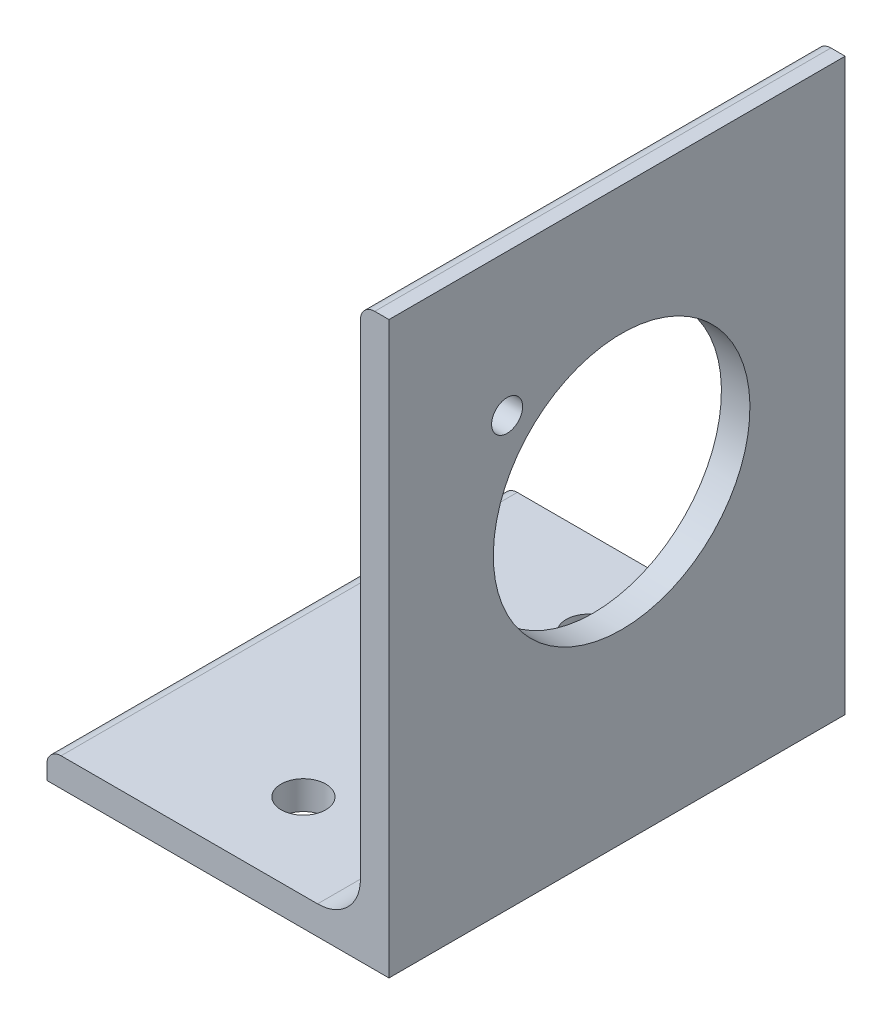
ISO-10303-21;
HEADER;
FILE_DESCRIPTION(('STEP AP214'),'2;1');
FILE_NAME('part.step','',(''),(''),'','','');
FILE_SCHEMA(('AUTOMOTIVE_DESIGN { 1 0 10303 214 1 1 1 1 }'));
ENDSEC;
DATA;
#1=APPLICATION_CONTEXT('core data for automotive mechanical design processes');
#2=APPLICATION_PROTOCOL_DEFINITION('international standard','automotive_design',2000,#1);
#3=PRODUCT_CONTEXT('',#1,'mechanical');
#4=PRODUCT('Part','Part','',(#3));
#5=PRODUCT_RELATED_PRODUCT_CATEGORY('part','',(#4));
#6=PRODUCT_DEFINITION_FORMATION('','',#4);
#7=PRODUCT_DEFINITION_CONTEXT('part definition',#1,'design');
#8=PRODUCT_DEFINITION('design','',#6,#7);
#9=PRODUCT_DEFINITION_SHAPE('','',#8);
#10=(LENGTH_UNIT() NAMED_UNIT(*) SI_UNIT(.MILLI.,.METRE.));
#11=(NAMED_UNIT(*) PLANE_ANGLE_UNIT() SI_UNIT($,.RADIAN.));
#12=(NAMED_UNIT(*) SI_UNIT($,.STERADIAN.) SOLID_ANGLE_UNIT());
#13=UNCERTAINTY_MEASURE_WITH_UNIT(LENGTH_MEASURE(1.E-05),#10,'distance_accuracy_value','');
#14=(GEOMETRIC_REPRESENTATION_CONTEXT(3) GLOBAL_UNCERTAINTY_ASSIGNED_CONTEXT((#13)) GLOBAL_UNIT_ASSIGNED_CONTEXT((#10,
#11,#12)) REPRESENTATION_CONTEXT('',''));
#15=CARTESIAN_POINT('',(0.,0.,0.));
#16=DIRECTION('',(0.,0.,1.));
#17=DIRECTION('',(1.,0.,0.));
#18=AXIS2_PLACEMENT_3D('',#15,#16,#17);
#19=CARTESIAN_POINT('',(-19.05,-30.1625,25.4));
#20=DIRECTION('',(1.,0.,0.));
#21=DIRECTION('',(0.,0.,-1.));
#22=AXIS2_PLACEMENT_3D('',#19,#20,#21);
#23=PLANE('',#22);
#24=DIRECTION('',(0.,-1.,0.));
#25=VECTOR('',#24,1.);
#26=CARTESIAN_POINT('',(-19.05,-30.1625,-25.4));
#27=LINE('',#26,#25);
#28=CARTESIAN_POINT('',(-19.05,-30.1625,-25.4));
#29=VERTEX_POINT('',#28);
#30=CARTESIAN_POINT('',(-19.05,-31.75,-25.4));
#31=VERTEX_POINT('',#30);
#32=EDGE_CURVE('E143',#29,#31,#27,.T.);
#33=ORIENTED_EDGE('',*,*,#32,.T.);
#34=DIRECTION('',(0.,0.,-1.));
#35=VECTOR('',#34,1.);
#36=CARTESIAN_POINT('',(-19.05,-31.75,25.4));
#37=LINE('',#36,#35);
#38=CARTESIAN_POINT('',(-19.05,-31.75,25.4));
#39=VERTEX_POINT('',#38);
#40=EDGE_CURVE('E11',#39,#31,#37,.T.);
#41=ORIENTED_EDGE('',*,*,#40,.F.);
#42=DIRECTION('',(0.,-1.,0.));
#43=VECTOR('',#42,1.);
#44=CARTESIAN_POINT('',(-19.05,-30.1625,25.4));
#45=LINE('',#44,#43);
#46=CARTESIAN_POINT('',(-19.05,-30.1625,25.4));
#47=VERTEX_POINT('',#46);
#48=EDGE_CURVE('E160',#47,#39,#45,.T.);
#49=ORIENTED_EDGE('',*,*,#48,.F.);
#50=DIRECTION('',(0.,0.,-1.));
#51=VECTOR('',#50,1.);
#52=CARTESIAN_POINT('',(-19.05,-30.1625,25.4));
#53=LINE('',#52,#51);
#54=EDGE_CURVE('E139',#47,#29,#53,.T.);
#55=ORIENTED_EDGE('',*,*,#54,.T.);
#56=EDGE_LOOP('',(#33,#41,#49,#55));
#57=FACE_BOUND('',#56,.T.);
#58=ADVANCED_FACE('F39',(#57),#23,.F.);
#59=CARTESIAN_POINT('',(-19.05,-31.75,25.4));
#60=DIRECTION('',(0.,1.,0.));
#61=DIRECTION('',(-1.,0.,0.));
#62=AXIS2_PLACEMENT_3D('',#59,#60,#61);
#63=PLANE('',#62);
#64=CARTESIAN_POINT('',(0.,-31.75,15.875));
#65=DIRECTION('',(0.,-1.,0.));
#66=DIRECTION('',(1.,0.,0.));
#67=AXIS2_PLACEMENT_3D('',#64,#65,#66);
#68=CIRCLE('',#67,2.4892);
#69=CARTESIAN_POINT('',(2.4892,-31.75,15.875));
#70=VERTEX_POINT('',#69);
#71=EDGE_CURVE('E176',#70,#70,#68,.T.);
#72=ORIENTED_EDGE('',*,*,#71,.F.);
#73=EDGE_LOOP('',(#72));
#74=FACE_BOUND('',#73,.T.);
#75=CARTESIAN_POINT('',(0.,-31.75,-15.875));
#76=DIRECTION('',(0.,-1.,0.));
#77=DIRECTION('',(1.,0.,0.));
#78=AXIS2_PLACEMENT_3D('',#75,#76,#77);
#79=CIRCLE('',#78,2.4892);
#80=CARTESIAN_POINT('',(2.4892,-31.75,-15.875));
#81=VERTEX_POINT('',#80);
#82=EDGE_CURVE('E182',#81,#81,#79,.T.);
#83=ORIENTED_EDGE('',*,*,#82,.F.);
#84=EDGE_LOOP('',(#83));
#85=FACE_BOUND('',#84,.T.);
#86=DIRECTION('',(1.,0.,0.));
#87=VECTOR('',#86,1.);
#88=CARTESIAN_POINT('',(-19.05,-31.75,-25.4));
#89=LINE('',#88,#87);
#90=CARTESIAN_POINT('',(19.05,-31.75,-25.4));
#91=VERTEX_POINT('',#90);
#92=EDGE_CURVE('E146',#31,#91,#89,.T.);
#93=ORIENTED_EDGE('',*,*,#92,.T.);
#94=DIRECTION('',(0.,0.,-1.));
#95=VECTOR('',#94,1.);
#96=CARTESIAN_POINT('',(19.05,-31.75,25.4));
#97=LINE('',#96,#95);
#98=CARTESIAN_POINT('',(19.05,-31.75,25.4));
#99=VERTEX_POINT('',#98);
#100=EDGE_CURVE('E48',#99,#91,#97,.T.);
#101=ORIENTED_EDGE('',*,*,#100,.F.);
#102=DIRECTION('',(1.,0.,0.));
#103=VECTOR('',#102,1.);
#104=CARTESIAN_POINT('',(-19.05,-31.75,25.4));
#105=LINE('',#104,#103);
#106=EDGE_CURVE('E103',#39,#99,#105,.T.);
#107=ORIENTED_EDGE('',*,*,#106,.F.);
#108=ORIENTED_EDGE('',*,*,#40,.T.);
#109=EDGE_LOOP('',(#93,#101,#107,#108));
#110=FACE_BOUND('',#109,.T.);
#111=ADVANCED_FACE('F235',(#74,#85,#110),#63,.F.);
#112=CARTESIAN_POINT('',(19.05,-31.75,25.4));
#113=DIRECTION('',(-1.,0.,0.));
#114=DIRECTION('',(0.,-1.,0.));
#115=AXIS2_PLACEMENT_3D('',#112,#113,#114);
#116=PLANE('',#115);
#117=CARTESIAN_POINT('',(19.05,15.9269636919197,12.2439637819415));
#118=DIRECTION('',(-1.,0.,0.));
#119=DIRECTION('',(0.,-1.,0.));
#120=AXIS2_PLACEMENT_3D('',#117,#118,#119);
#121=CIRCLE('',#120,1.72719999999923);
#122=CARTESIAN_POINT('',(19.05,14.1997636919204,12.2439637819415));
#123=VERTEX_POINT('',#122);
#124=EDGE_CURVE('E180',#123,#123,#121,.T.);
#125=ORIENTED_EDGE('',*,*,#124,.T.);
#126=EDGE_LOOP('',(#125));
#127=FACE_BOUND('',#126,.T.);
#128=CARTESIAN_POINT('',(19.05,3.17500000000147,-0.507999909976729));
#129=DIRECTION('',(-1.,0.,0.));
#130=DIRECTION('',(0.,-1.,0.));
#131=AXIS2_PLACEMENT_3D('',#128,#129,#130);
#132=CIRCLE('',#131,14.2874999999992);
#133=CARTESIAN_POINT('',(19.05,-11.1124999999978,-0.507999909976729));
#134=VERTEX_POINT('',#133);
#135=EDGE_CURVE('E147',#134,#134,#132,.T.);
#136=ORIENTED_EDGE('',*,*,#135,.T.);
#137=EDGE_LOOP('',(#136));
#138=FACE_BOUND('',#137,.T.);
#139=DIRECTION('',(0.,1.,0.));
#140=VECTOR('',#139,1.);
#141=CARTESIAN_POINT('',(19.05,-31.75,-25.4));
#142=LINE('',#141,#140);
#143=CARTESIAN_POINT('',(19.05,31.75,-25.4));
#144=VERTEX_POINT('',#143);
#145=EDGE_CURVE('E149',#91,#144,#142,.T.);
#146=ORIENTED_EDGE('',*,*,#145,.T.);
#147=DIRECTION('',(0.,0.,-1.));
#148=VECTOR('',#147,1.);
#149=CARTESIAN_POINT('',(19.05,31.75,25.4));
#150=LINE('',#149,#148);
#151=CARTESIAN_POINT('',(19.05,31.75,25.4));
#152=VERTEX_POINT('',#151);
#153=EDGE_CURVE('E170',#152,#144,#150,.T.);
#154=ORIENTED_EDGE('',*,*,#153,.F.);
#155=DIRECTION('',(0.,1.,0.));
#156=VECTOR('',#155,1.);
#157=CARTESIAN_POINT('',(19.05,-31.75,25.4));
#158=LINE('',#157,#156);
#159=EDGE_CURVE('E201',#99,#152,#158,.T.);
#160=ORIENTED_EDGE('',*,*,#159,.F.);
#161=ORIENTED_EDGE('',*,*,#100,.T.);
#162=EDGE_LOOP('',(#146,#154,#160,#161));
#163=FACE_BOUND('',#162,.T.);
#164=ADVANCED_FACE('F239',(#127,#138,#163),#116,.F.);
#165=CARTESIAN_POINT('',(17.4625,31.75,25.4));
#166=DIRECTION('',(0.,-1.,0.));
#167=DIRECTION('',(1.,0.,0.));
#168=AXIS2_PLACEMENT_3D('',#165,#166,#167);
#169=PLANE('',#168);
#170=DIRECTION('',(-1.,0.,0.));
#171=VECTOR('',#170,1.);
#172=CARTESIAN_POINT('',(17.4625,31.75,-25.4));
#173=LINE('',#172,#171);
#174=CARTESIAN_POINT('',(17.4625,31.75,-25.4));
#175=VERTEX_POINT('',#174);
#176=EDGE_CURVE('E151',#144,#175,#173,.T.);
#177=ORIENTED_EDGE('',*,*,#176,.T.);
#178=DIRECTION('',(0.,0.,-1.));
#179=VECTOR('',#178,1.);
#180=CARTESIAN_POINT('',(17.4625,31.75,25.4));
#181=LINE('',#180,#179);
#182=CARTESIAN_POINT('',(17.4625,31.75,25.4));
#183=VERTEX_POINT('',#182);
#184=EDGE_CURVE('E167',#183,#175,#181,.T.);
#185=ORIENTED_EDGE('',*,*,#184,.F.);
#186=DIRECTION('',(-1.,0.,0.));
#187=VECTOR('',#186,1.);
#188=CARTESIAN_POINT('',(17.4625,31.75,25.4));
#189=LINE('',#188,#187);
#190=EDGE_CURVE('E203',#152,#183,#189,.T.);
#191=ORIENTED_EDGE('',*,*,#190,.F.);
#192=ORIENTED_EDGE('',*,*,#153,.T.);
#193=EDGE_LOOP('',(#177,#185,#191,#192));
#194=FACE_BOUND('',#193,.T.);
#195=ADVANCED_FACE('F244',(#194),#169,.F.);
#196=CARTESIAN_POINT('',(17.4625,30.1625,25.4));
#197=DIRECTION('',(0.,0.,-1.));
#198=DIRECTION('',(-1.,0.,0.));
#199=AXIS2_PLACEMENT_3D('',#196,#197,#198);
#200=CYLINDRICAL_SURFACE('',#199,1.5875);
#201=CARTESIAN_POINT('',(17.4625,30.1625,-25.4));
#202=DIRECTION('',(0.,0.,1.));
#203=DIRECTION('',(-1.,0.,0.));
#204=AXIS2_PLACEMENT_3D('',#201,#202,#203);
#205=CIRCLE('',#204,1.5875);
#206=CARTESIAN_POINT('',(15.875,30.1625,-25.4));
#207=VERTEX_POINT('',#206);
#208=EDGE_CURVE('E153',#175,#207,#205,.T.);
#209=ORIENTED_EDGE('',*,*,#208,.T.);
#210=DIRECTION('',(0.,0.,-1.));
#211=VECTOR('',#210,1.);
#212=CARTESIAN_POINT('',(15.875,30.1625,25.4));
#213=LINE('',#212,#211);
#214=CARTESIAN_POINT('',(15.875,30.1625,25.4));
#215=VERTEX_POINT('',#214);
#216=EDGE_CURVE('E164',#215,#207,#213,.T.);
#217=ORIENTED_EDGE('',*,*,#216,.F.);
#218=CARTESIAN_POINT('',(17.4625,30.1625,25.4));
#219=DIRECTION('',(0.,0.,1.));
#220=DIRECTION('',(-1.,0.,0.));
#221=AXIS2_PLACEMENT_3D('',#218,#219,#220);
#222=CIRCLE('',#221,1.5875);
#223=EDGE_CURVE('E205',#183,#215,#222,.T.);
#224=ORIENTED_EDGE('',*,*,#223,.F.);
#225=ORIENTED_EDGE('',*,*,#184,.T.);
#226=EDGE_LOOP('',(#209,#217,#224,#225));
#227=FACE_BOUND('',#226,.T.);
#228=ADVANCED_FACE('F211',(#227),#200,.T.);
#229=CARTESIAN_POINT('',(15.875,30.1625,25.4));
#230=DIRECTION('',(1.,0.,0.));
#231=DIRECTION('',(0.,1.,0.));
#232=AXIS2_PLACEMENT_3D('',#229,#230,#231);
#233=PLANE('',#232);
#234=CARTESIAN_POINT('',(15.875,15.9269636919197,12.2439637819415));
#235=DIRECTION('',(-1.,0.,0.));
#236=DIRECTION('',(0.,-1.,0.));
#237=AXIS2_PLACEMENT_3D('',#234,#235,#236);
#238=CIRCLE('',#237,1.72719999999923);
#239=CARTESIAN_POINT('',(15.875,14.1997636919204,12.2439637819415));
#240=VERTEX_POINT('',#239);
#241=EDGE_CURVE('E189',#240,#240,#238,.T.);
#242=ORIENTED_EDGE('',*,*,#241,.F.);
#243=EDGE_LOOP('',(#242));
#244=FACE_BOUND('',#243,.T.);
#245=CARTESIAN_POINT('',(15.875,3.17500000000147,-0.507999909976729));
#246=DIRECTION('',(-1.,0.,0.));
#247=DIRECTION('',(0.,-1.,0.));
#248=AXIS2_PLACEMENT_3D('',#245,#246,#247);
#249=CIRCLE('',#248,14.2874999999992);
#250=CARTESIAN_POINT('',(15.875,-11.1124999999978,-0.507999909976729));
#251=VERTEX_POINT('',#250);
#252=EDGE_CURVE('E192',#251,#251,#249,.T.);
#253=ORIENTED_EDGE('',*,*,#252,.F.);
#254=EDGE_LOOP('',(#253));
#255=FACE_BOUND('',#254,.T.);
#256=DIRECTION('',(0.,-1.,0.));
#257=VECTOR('',#256,1.);
#258=CARTESIAN_POINT('',(15.875,30.1625,-25.4));
#259=LINE('',#258,#257);
#260=CARTESIAN_POINT('',(15.875,-23.7998,-25.4));
#261=VERTEX_POINT('',#260);
#262=EDGE_CURVE('E155',#207,#261,#259,.T.);
#263=ORIENTED_EDGE('',*,*,#262,.T.);
#264=DIRECTION('',(0.,0.,-1.));
#265=VECTOR('',#264,1.);
#266=CARTESIAN_POINT('',(15.875,-23.7998,25.4));
#267=LINE('',#266,#265);
#268=CARTESIAN_POINT('',(15.875,-23.7998,25.4));
#269=VERTEX_POINT('',#268);
#270=EDGE_CURVE('E134',#269,#261,#267,.T.);
#271=ORIENTED_EDGE('',*,*,#270,.F.);
#272=DIRECTION('',(0.,-1.,0.));
#273=VECTOR('',#272,1.);
#274=CARTESIAN_POINT('',(15.875,30.1625,25.4));
#275=LINE('',#274,#273);
#276=EDGE_CURVE('E125',#215,#269,#275,.T.);
#277=ORIENTED_EDGE('',*,*,#276,.F.);
#278=ORIENTED_EDGE('',*,*,#216,.T.);
#279=EDGE_LOOP('',(#263,#271,#277,#278));
#280=FACE_BOUND('',#279,.T.);
#281=ADVANCED_FACE('F215',(#244,#255,#280),#233,.F.);
#282=CARTESIAN_POINT('',(11.0998,-23.7998,25.4));
#283=DIRECTION('',(0.,0.,-1.));
#284=DIRECTION('',(-1.,0.,0.));
#285=AXIS2_PLACEMENT_3D('',#282,#283,#284);
#286=CYLINDRICAL_SURFACE('',#285,4.7752);
#287=CARTESIAN_POINT('',(11.0998,-23.7998,-25.4));
#288=DIRECTION('',(0.,0.,-1.));
#289=DIRECTION('',(-1.,0.,0.));
#290=AXIS2_PLACEMENT_3D('',#287,#288,#289);
#291=CIRCLE('',#290,4.7752);
#292=CARTESIAN_POINT('',(11.0998,-28.575,-25.4));
#293=VERTEX_POINT('',#292);
#294=EDGE_CURVE('E133',#261,#293,#291,.T.);
#295=ORIENTED_EDGE('',*,*,#294,.T.);
#296=DIRECTION('',(0.,0.,-1.));
#297=VECTOR('',#296,1.);
#298=CARTESIAN_POINT('',(11.0998,-28.575,25.4));
#299=LINE('',#298,#297);
#300=CARTESIAN_POINT('',(11.0998,-28.575,25.4));
#301=VERTEX_POINT('',#300);
#302=EDGE_CURVE('E130',#301,#293,#299,.T.);
#303=ORIENTED_EDGE('',*,*,#302,.F.);
#304=CARTESIAN_POINT('',(11.0998,-23.7998,25.4));
#305=DIRECTION('',(0.,0.,-1.));
#306=DIRECTION('',(-1.,0.,0.));
#307=AXIS2_PLACEMENT_3D('',#304,#305,#306);
#308=CIRCLE('',#307,4.7752);
#309=EDGE_CURVE('E119',#269,#301,#308,.T.);
#310=ORIENTED_EDGE('',*,*,#309,.F.);
#311=ORIENTED_EDGE('',*,*,#270,.T.);
#312=EDGE_LOOP('',(#295,#303,#310,#311));
#313=FACE_BOUND('',#312,.T.);
#314=ADVANCED_FACE('F131',(#313),#286,.F.);
#315=CARTESIAN_POINT('',(11.0998,-28.575,25.4));
#316=DIRECTION('',(0.,-1.,0.));
#317=DIRECTION('',(1.,0.,0.));
#318=AXIS2_PLACEMENT_3D('',#315,#316,#317);
#319=PLANE('',#318);
#320=CARTESIAN_POINT('',(0.,-28.575,15.875));
#321=DIRECTION('',(0.,-1.,0.));
#322=DIRECTION('',(1.,0.,0.));
#323=AXIS2_PLACEMENT_3D('',#320,#321,#322);
#324=CIRCLE('',#323,2.4892);
#325=CARTESIAN_POINT('',(2.4892,-28.575,15.875));
#326=VERTEX_POINT('',#325);
#327=EDGE_CURVE('E42',#326,#326,#324,.T.);
#328=ORIENTED_EDGE('',*,*,#327,.T.);
#329=EDGE_LOOP('',(#328));
#330=FACE_BOUND('',#329,.T.);
#331=CARTESIAN_POINT('',(0.,-28.575,-15.875));
#332=DIRECTION('',(0.,-1.,0.));
#333=DIRECTION('',(1.,0.,0.));
#334=AXIS2_PLACEMENT_3D('',#331,#332,#333);
#335=CIRCLE('',#334,2.4892);
#336=CARTESIAN_POINT('',(2.4892,-28.575,-15.875));
#337=VERTEX_POINT('',#336);
#338=EDGE_CURVE('E174',#337,#337,#335,.T.);
#339=ORIENTED_EDGE('',*,*,#338,.T.);
#340=EDGE_LOOP('',(#339));
#341=FACE_BOUND('',#340,.T.);
#342=DIRECTION('',(-1.,0.,0.));
#343=VECTOR('',#342,1.);
#344=CARTESIAN_POINT('',(11.0998,-28.575,-25.4));
#345=LINE('',#344,#343);
#346=CARTESIAN_POINT('',(-17.4625,-28.575,-25.4));
#347=VERTEX_POINT('',#346);
#348=EDGE_CURVE('E89',#293,#347,#345,.T.);
#349=ORIENTED_EDGE('',*,*,#348,.T.);
#350=DIRECTION('',(0.,0.,-1.));
#351=VECTOR('',#350,1.);
#352=CARTESIAN_POINT('',(-17.4625,-28.575,25.4));
#353=LINE('',#352,#351);
#354=CARTESIAN_POINT('',(-17.4625,-28.575,25.4));
#355=VERTEX_POINT('',#354);
#356=EDGE_CURVE('E135',#355,#347,#353,.T.);
#357=ORIENTED_EDGE('',*,*,#356,.F.);
#358=DIRECTION('',(-1.,0.,0.));
#359=VECTOR('',#358,1.);
#360=CARTESIAN_POINT('',(11.0998,-28.575,25.4));
#361=LINE('',#360,#359);
#362=EDGE_CURVE('E123',#301,#355,#361,.T.);
#363=ORIENTED_EDGE('',*,*,#362,.F.);
#364=ORIENTED_EDGE('',*,*,#302,.T.);
#365=EDGE_LOOP('',(#349,#357,#363,#364));
#366=FACE_BOUND('',#365,.T.);
#367=ADVANCED_FACE('F137',(#330,#341,#366),#319,.F.);
#368=CARTESIAN_POINT('',(-17.4625,-30.1625,25.4));
#369=DIRECTION('',(0.,0.,-1.));
#370=DIRECTION('',(-1.,0.,0.));
#371=AXIS2_PLACEMENT_3D('',#368,#369,#370);
#372=CYLINDRICAL_SURFACE('',#371,1.5875);
#373=CARTESIAN_POINT('',(-17.4625,-30.1625,-25.4));
#374=DIRECTION('',(0.,0.,1.));
#375=DIRECTION('',(-1.,0.,0.));
#376=AXIS2_PLACEMENT_3D('',#373,#374,#375);
#377=CIRCLE('',#376,1.5875);
#378=EDGE_CURVE('E95',#347,#29,#377,.T.);
#379=ORIENTED_EDGE('',*,*,#378,.T.);
#380=ORIENTED_EDGE('',*,*,#54,.F.);
#381=CARTESIAN_POINT('',(-17.4625,-30.1625,25.4));
#382=DIRECTION('',(0.,0.,1.));
#383=DIRECTION('',(-1.,0.,0.));
#384=AXIS2_PLACEMENT_3D('',#381,#382,#383);
#385=CIRCLE('',#384,1.5875);
#386=EDGE_CURVE('E57',#355,#47,#385,.T.);
#387=ORIENTED_EDGE('',*,*,#386,.F.);
#388=ORIENTED_EDGE('',*,*,#356,.T.);
#389=EDGE_LOOP('',(#379,#380,#387,#388));
#390=FACE_BOUND('',#389,.T.);
#391=ADVANCED_FACE('F223',(#390),#372,.T.);
#392=CARTESIAN_POINT('',(17.4625,30.1625,25.4));
#393=DIRECTION('',(0.,0.,-1.));
#394=DIRECTION('',(-1.,0.,0.));
#395=AXIS2_PLACEMENT_3D('',#392,#393,#394);
#396=PLANE('',#395);
#397=ORIENTED_EDGE('',*,*,#48,.T.);
#398=ORIENTED_EDGE('',*,*,#106,.T.);
#399=ORIENTED_EDGE('',*,*,#159,.T.);
#400=ORIENTED_EDGE('',*,*,#190,.T.);
#401=ORIENTED_EDGE('',*,*,#223,.T.);
#402=ORIENTED_EDGE('',*,*,#276,.T.);
#403=ORIENTED_EDGE('',*,*,#309,.T.);
#404=ORIENTED_EDGE('',*,*,#362,.T.);
#405=ORIENTED_EDGE('',*,*,#386,.T.);
#406=EDGE_LOOP('',(#397,#398,#399,#400,#401,#402,#403,#404,#405));
#407=FACE_BOUND('',#406,.T.);
#408=ADVANCED_FACE('F121',(#407),#396,.F.);
#409=CARTESIAN_POINT('',(17.4625,30.1625,-25.4));
#410=DIRECTION('',(0.,0.,-1.));
#411=DIRECTION('',(-1.,0.,0.));
#412=AXIS2_PLACEMENT_3D('',#409,#410,#411);
#413=PLANE('',#412);
#414=ORIENTED_EDGE('',*,*,#32,.F.);
#415=ORIENTED_EDGE('',*,*,#378,.F.);
#416=ORIENTED_EDGE('',*,*,#348,.F.);
#417=ORIENTED_EDGE('',*,*,#294,.F.);
#418=ORIENTED_EDGE('',*,*,#262,.F.);
#419=ORIENTED_EDGE('',*,*,#208,.F.);
#420=ORIENTED_EDGE('',*,*,#176,.F.);
#421=ORIENTED_EDGE('',*,*,#145,.F.);
#422=ORIENTED_EDGE('',*,*,#92,.F.);
#423=EDGE_LOOP('',(#414,#415,#416,#417,#418,#419,#420,#421,#422));
#424=FACE_BOUND('',#423,.T.);
#425=ADVANCED_FACE('F218',(#424),#413,.T.);
#426=CARTESIAN_POINT('',(19.05,3.17500000000147,-0.507999909976729));
#427=DIRECTION('',(-1.,0.,0.));
#428=DIRECTION('',(0.,-1.,0.));
#429=AXIS2_PLACEMENT_3D('',#426,#427,#428);
#430=CYLINDRICAL_SURFACE('',#429,14.2874999999992);
#431=ORIENTED_EDGE('',*,*,#135,.F.);
#432=EDGE_LOOP('',(#431));
#433=FACE_BOUND('',#432,.T.);
#434=ORIENTED_EDGE('',*,*,#252,.T.);
#435=EDGE_LOOP('',(#434));
#436=FACE_BOUND('',#435,.T.);
#437=ADVANCED_FACE('F305',(#433,#436),#430,.F.);
#438=CARTESIAN_POINT('',(19.05,15.9269636919197,12.2439637819415));
#439=DIRECTION('',(-1.,0.,0.));
#440=DIRECTION('',(0.,-1.,0.));
#441=AXIS2_PLACEMENT_3D('',#438,#439,#440);
#442=CYLINDRICAL_SURFACE('',#441,1.72719999999923);
#443=ORIENTED_EDGE('',*,*,#124,.F.);
#444=EDGE_LOOP('',(#443));
#445=FACE_BOUND('',#444,.T.);
#446=ORIENTED_EDGE('',*,*,#241,.T.);
#447=EDGE_LOOP('',(#446));
#448=FACE_BOUND('',#447,.T.);
#449=ADVANCED_FACE('F283',(#445,#448),#442,.F.);
#450=CARTESIAN_POINT('',(0.,31.75,-15.875));
#451=DIRECTION('',(0.,-1.,0.));
#452=DIRECTION('',(1.,0.,0.));
#453=AXIS2_PLACEMENT_3D('',#450,#451,#452);
#454=CYLINDRICAL_SURFACE('',#453,2.4892);
#455=ORIENTED_EDGE('',*,*,#82,.T.);
#456=EDGE_LOOP('',(#455));
#457=FACE_BOUND('',#456,.T.);
#458=ORIENTED_EDGE('',*,*,#338,.F.);
#459=EDGE_LOOP('',(#458));
#460=FACE_BOUND('',#459,.T.);
#461=ADVANCED_FACE('F277',(#457,#460),#454,.F.);
#462=CARTESIAN_POINT('',(0.,31.75,15.875));
#463=DIRECTION('',(0.,-1.,0.));
#464=DIRECTION('',(1.,0.,0.));
#465=AXIS2_PLACEMENT_3D('',#462,#463,#464);
#466=CYLINDRICAL_SURFACE('',#465,2.4892);
#467=ORIENTED_EDGE('',*,*,#71,.T.);
#468=EDGE_LOOP('',(#467));
#469=FACE_BOUND('',#468,.T.);
#470=ORIENTED_EDGE('',*,*,#327,.F.);
#471=EDGE_LOOP('',(#470));
#472=FACE_BOUND('',#471,.T.);
#473=ADVANCED_FACE('F282',(#469,#472),#466,.F.);
#474=CLOSED_SHELL('',(#58,#111,#164,#195,#228,#281,#314,#367,#391,#408,#425,#437,#449,#461,#473));
#475=MANIFOLD_SOLID_BREP('B2',#474);
#476=ADVANCED_BREP_SHAPE_REPRESENTATION('',(#18,#475),#14);
#477=SHAPE_DEFINITION_REPRESENTATION(#9,#476);
ENDSEC;
END-ISO-10303-21;
